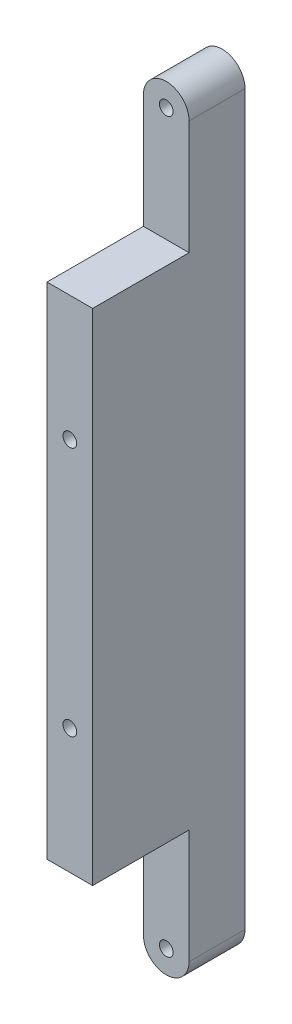
ISO-10303-21;
HEADER;
FILE_DESCRIPTION(('STEP AP214'),'2;1');
FILE_NAME('part.step','',(''),(''),'','','');
FILE_SCHEMA(('AUTOMOTIVE_DESIGN { 1 0 10303 214 1 1 1 1 }'));
ENDSEC;
DATA;
#1=APPLICATION_CONTEXT('core data for automotive mechanical design processes');
#2=APPLICATION_PROTOCOL_DEFINITION('international standard','automotive_design',2000,#1);
#3=PRODUCT_CONTEXT('',#1,'mechanical');
#4=PRODUCT('Part','Part','',(#3));
#5=PRODUCT_RELATED_PRODUCT_CATEGORY('part','',(#4));
#6=PRODUCT_DEFINITION_FORMATION('','',#4);
#7=PRODUCT_DEFINITION_CONTEXT('part definition',#1,'design');
#8=PRODUCT_DEFINITION('design','',#6,#7);
#9=PRODUCT_DEFINITION_SHAPE('','',#8);
#10=(LENGTH_UNIT() NAMED_UNIT(*) SI_UNIT(.MILLI.,.METRE.));
#11=(NAMED_UNIT(*) PLANE_ANGLE_UNIT() SI_UNIT($,.RADIAN.));
#12=(NAMED_UNIT(*) SI_UNIT($,.STERADIAN.) SOLID_ANGLE_UNIT());
#13=UNCERTAINTY_MEASURE_WITH_UNIT(LENGTH_MEASURE(1.E-05),#10,'distance_accuracy_value','');
#14=(GEOMETRIC_REPRESENTATION_CONTEXT(3) GLOBAL_UNCERTAINTY_ASSIGNED_CONTEXT((#13)) GLOBAL_UNIT_ASSIGNED_CONTEXT((#10,
#11,#12)) REPRESENTATION_CONTEXT('',''));
#15=CARTESIAN_POINT('',(0.,0.,0.));
#16=DIRECTION('',(0.,0.,1.));
#17=DIRECTION('',(1.,0.,0.));
#18=AXIS2_PLACEMENT_3D('',#15,#16,#17);
#19=CARTESIAN_POINT('',(0.,10.,0.));
#20=DIRECTION('',(0.,-1.,0.));
#21=DIRECTION('',(0.,0.,-1.));
#22=AXIS2_PLACEMENT_3D('',#19,#20,#21);
#23=PLANE('',#22);
#24=DIRECTION('',(1.,0.,0.));
#25=VECTOR('',#24,1.);
#26=CARTESIAN_POINT('',(0.,10.,13.35));
#27=LINE('',#26,#25);
#28=CARTESIAN_POINT('',(-2.,10.,13.35));
#29=VERTEX_POINT('',#28);
#30=CARTESIAN_POINT('',(2.,10.,13.35));
#31=VERTEX_POINT('',#30);
#32=EDGE_CURVE('E142',#29,#31,#27,.T.);
#33=ORIENTED_EDGE('',*,*,#32,.F.);
#34=DIRECTION('',(0.,0.,-1.));
#35=VECTOR('',#34,1.);
#36=CARTESIAN_POINT('',(-2.,10.,0.));
#37=LINE('',#36,#35);
#38=CARTESIAN_POINT('',(-2.,10.,4.9));
#39=VERTEX_POINT('',#38);
#40=EDGE_CURVE('E79',#29,#39,#37,.T.);
#41=ORIENTED_EDGE('',*,*,#40,.T.);
#42=DIRECTION('',(-1.,0.,0.));
#43=VECTOR('',#42,1.);
#44=CARTESIAN_POINT('',(-2.,10.,4.9));
#45=LINE('',#44,#43);
#46=CARTESIAN_POINT('',(2.,10.,4.9));
#47=VERTEX_POINT('',#46);
#48=EDGE_CURVE('E53',#47,#39,#45,.T.);
#49=ORIENTED_EDGE('',*,*,#48,.F.);
#50=DIRECTION('',(0.,0.,1.));
#51=VECTOR('',#50,1.);
#52=CARTESIAN_POINT('',(2.,10.,0.));
#53=LINE('',#52,#51);
#54=EDGE_CURVE('E162',#47,#31,#53,.T.);
#55=ORIENTED_EDGE('',*,*,#54,.T.);
#56=EDGE_LOOP('',(#33,#41,#49,#55));
#57=FACE_BOUND('',#56,.T.);
#58=ADVANCED_FACE('F45',(#57),#23,.T.);
#59=CARTESIAN_POINT('',(0.,0.,20.));
#60=DIRECTION('',(0.,0.,-1.));
#61=DIRECTION('',(-1.,0.,0.));
#62=AXIS2_PLACEMENT_3D('',#59,#60,#61);
#63=CYLINDRICAL_SURFACE('',#62,0.6);
#64=CARTESIAN_POINT('',(0.,0.,0.));
#65=DIRECTION('',(0.,0.,1.));
#66=DIRECTION('',(1.,0.,0.));
#67=AXIS2_PLACEMENT_3D('',#64,#65,#66);
#68=CIRCLE('',#67,0.6);
#69=CARTESIAN_POINT('',(0.6,0.,0.));
#70=VERTEX_POINT('',#69);
#71=EDGE_CURVE('E170',#70,#70,#68,.T.);
#72=ORIENTED_EDGE('',*,*,#71,.F.);
#73=EDGE_LOOP('',(#72));
#74=FACE_BOUND('',#73,.T.);
#75=CARTESIAN_POINT('',(0.,0.,4.9));
#76=DIRECTION('',(0.,0.,-1.));
#77=DIRECTION('',(-1.,0.,0.));
#78=AXIS2_PLACEMENT_3D('',#75,#76,#77);
#79=CIRCLE('',#78,0.6);
#80=CARTESIAN_POINT('',(-0.6,0.,4.9));
#81=VERTEX_POINT('',#80);
#82=EDGE_CURVE('E176',#81,#81,#79,.T.);
#83=ORIENTED_EDGE('',*,*,#82,.F.);
#84=EDGE_LOOP('',(#83));
#85=FACE_BOUND('',#84,.T.);
#86=ADVANCED_FACE('F212',(#74,#85),#63,.F.);
#87=CARTESIAN_POINT('',(-2.,10.,0.));
#88=DIRECTION('',(1.,0.,0.));
#89=DIRECTION('',(0.,0.,-1.));
#90=AXIS2_PLACEMENT_3D('',#87,#88,#89);
#91=PLANE('',#90);
#92=ORIENTED_EDGE('',*,*,#40,.F.);
#93=DIRECTION('',(0.,-1.,0.));
#94=VECTOR('',#93,1.);
#95=CARTESIAN_POINT('',(-2.,-2.,13.35));
#96=LINE('',#95,#94);
#97=CARTESIAN_POINT('',(-2.,53.8,13.35));
#98=VERTEX_POINT('',#97);
#99=EDGE_CURVE('E119',#98,#29,#96,.T.);
#100=ORIENTED_EDGE('',*,*,#99,.F.);
#101=DIRECTION('',(0.,0.,-1.));
#102=VECTOR('',#101,1.);
#103=CARTESIAN_POINT('',(-2.,53.8,0.));
#104=LINE('',#103,#102);
#105=CARTESIAN_POINT('',(-2.,53.8,4.9));
#106=VERTEX_POINT('',#105);
#107=EDGE_CURVE('E127',#98,#106,#104,.T.);
#108=ORIENTED_EDGE('',*,*,#107,.T.);
#109=DIRECTION('',(0.,-1.,0.));
#110=VECTOR('',#109,1.);
#111=CARTESIAN_POINT('',(-2.,65.8,4.9));
#112=LINE('',#111,#110);
#113=CARTESIAN_POINT('',(-2.,63.8,4.9));
#114=VERTEX_POINT('',#113);
#115=EDGE_CURVE('E140',#114,#106,#112,.T.);
#116=ORIENTED_EDGE('',*,*,#115,.F.);
#117=DIRECTION('',(0.,0.,1.));
#118=VECTOR('',#117,1.);
#119=CARTESIAN_POINT('',(-2.,63.8,0.));
#120=LINE('',#119,#118);
#121=CARTESIAN_POINT('',(-2.,63.8,0.));
#122=VERTEX_POINT('',#121);
#123=EDGE_CURVE('E136',#122,#114,#120,.T.);
#124=ORIENTED_EDGE('',*,*,#123,.F.);
#125=DIRECTION('',(0.,-1.,0.));
#126=VECTOR('',#125,1.);
#127=CARTESIAN_POINT('',(-2.,10.,0.));
#128=LINE('',#127,#126);
#129=CARTESIAN_POINT('',(-2.,0.,0.));
#130=VERTEX_POINT('',#129);
#131=EDGE_CURVE('E177',#122,#130,#128,.T.);
#132=ORIENTED_EDGE('',*,*,#131,.T.);
#133=DIRECTION('',(0.,0.,1.));
#134=VECTOR('',#133,1.);
#135=CARTESIAN_POINT('',(-2.,0.,0.));
#136=LINE('',#135,#134);
#137=CARTESIAN_POINT('',(-2.,0.,4.9));
#138=VERTEX_POINT('',#137);
#139=EDGE_CURVE('E87',#130,#138,#136,.T.);
#140=ORIENTED_EDGE('',*,*,#139,.T.);
#141=DIRECTION('',(0.,1.,0.));
#142=VECTOR('',#141,1.);
#143=CARTESIAN_POINT('',(-2.,-2.,4.9));
#144=LINE('',#143,#142);
#145=EDGE_CURVE('E181',#138,#39,#144,.T.);
#146=ORIENTED_EDGE('',*,*,#145,.T.);
#147=EDGE_LOOP('',(#92,#100,#108,#116,#124,#132,#140,#146));
#148=FACE_BOUND('',#147,.T.);
#149=ADVANCED_FACE('F125',(#148),#91,.F.);
#150=CARTESIAN_POINT('',(2.,10.,0.));
#151=DIRECTION('',(-1.,0.,0.));
#152=DIRECTION('',(0.,0.,1.));
#153=AXIS2_PLACEMENT_3D('',#150,#151,#152);
#154=PLANE('',#153);
#155=DIRECTION('',(0.,0.,1.));
#156=VECTOR('',#155,1.);
#157=CARTESIAN_POINT('',(2.,53.8,0.));
#158=LINE('',#157,#156);
#159=CARTESIAN_POINT('',(2.,53.8,4.9));
#160=VERTEX_POINT('',#159);
#161=CARTESIAN_POINT('',(2.,53.8,13.35));
#162=VERTEX_POINT('',#161);
#163=EDGE_CURVE('E137',#160,#162,#158,.T.);
#164=ORIENTED_EDGE('',*,*,#163,.T.);
#165=DIRECTION('',(0.,-1.,0.));
#166=VECTOR('',#165,1.);
#167=CARTESIAN_POINT('',(2.,-2.,13.35));
#168=LINE('',#167,#166);
#169=EDGE_CURVE('E59',#162,#31,#168,.T.);
#170=ORIENTED_EDGE('',*,*,#169,.T.);
#171=ORIENTED_EDGE('',*,*,#54,.F.);
#172=DIRECTION('',(0.,1.,0.));
#173=VECTOR('',#172,1.);
#174=CARTESIAN_POINT('',(2.,-2.,4.9));
#175=LINE('',#174,#173);
#176=CARTESIAN_POINT('',(2.,0.,4.9));
#177=VERTEX_POINT('',#176);
#178=EDGE_CURVE('E185',#177,#47,#175,.T.);
#179=ORIENTED_EDGE('',*,*,#178,.F.);
#180=DIRECTION('',(0.,0.,-1.));
#181=VECTOR('',#180,1.);
#182=CARTESIAN_POINT('',(2.,0.,0.));
#183=LINE('',#182,#181);
#184=CARTESIAN_POINT('',(2.,0.,0.));
#185=VERTEX_POINT('',#184);
#186=EDGE_CURVE('E180',#177,#185,#183,.T.);
#187=ORIENTED_EDGE('',*,*,#186,.T.);
#188=DIRECTION('',(0.,-1.,0.));
#189=VECTOR('',#188,1.);
#190=CARTESIAN_POINT('',(2.,10.,0.));
#191=LINE('',#190,#189);
#192=CARTESIAN_POINT('',(2.,63.8,0.));
#193=VERTEX_POINT('',#192);
#194=EDGE_CURVE('E173',#193,#185,#191,.T.);
#195=ORIENTED_EDGE('',*,*,#194,.F.);
#196=DIRECTION('',(0.,0.,-1.));
#197=VECTOR('',#196,1.);
#198=CARTESIAN_POINT('',(2.,63.8,0.));
#199=LINE('',#198,#197);
#200=CARTESIAN_POINT('',(2.,63.8,4.9));
#201=VERTEX_POINT('',#200);
#202=EDGE_CURVE('E155',#201,#193,#199,.T.);
#203=ORIENTED_EDGE('',*,*,#202,.F.);
#204=DIRECTION('',(0.,-1.,0.));
#205=VECTOR('',#204,1.);
#206=CARTESIAN_POINT('',(2.,65.8,4.9));
#207=LINE('',#206,#205);
#208=EDGE_CURVE('E158',#201,#160,#207,.T.);
#209=ORIENTED_EDGE('',*,*,#208,.T.);
#210=EDGE_LOOP('',(#164,#170,#171,#179,#187,#195,#203,#209));
#211=FACE_BOUND('',#210,.T.);
#212=ADVANCED_FACE('F199',(#211),#154,.F.);
#213=CARTESIAN_POINT('',(0.,0.,20.));
#214=DIRECTION('',(0.,0.,-1.));
#215=DIRECTION('',(-1.,0.,0.));
#216=AXIS2_PLACEMENT_3D('',#213,#214,#215);
#217=CYLINDRICAL_SURFACE('',#216,2.);
#218=ORIENTED_EDGE('',*,*,#186,.F.);
#219=CARTESIAN_POINT('',(0.,0.,4.9));
#220=DIRECTION('',(0.,0.,-1.));
#221=DIRECTION('',(-1.,0.,0.));
#222=AXIS2_PLACEMENT_3D('',#219,#220,#221);
#223=CIRCLE('',#222,2.);
#224=EDGE_CURVE('E68',#177,#138,#223,.T.);
#225=ORIENTED_EDGE('',*,*,#224,.T.);
#226=ORIENTED_EDGE('',*,*,#139,.F.);
#227=CARTESIAN_POINT('',(0.,0.,0.));
#228=DIRECTION('',(0.,0.,1.));
#229=DIRECTION('',(1.,0.,0.));
#230=AXIS2_PLACEMENT_3D('',#227,#228,#229);
#231=CIRCLE('',#230,2.);
#232=EDGE_CURVE('E168',#130,#185,#231,.T.);
#233=ORIENTED_EDGE('',*,*,#232,.T.);
#234=EDGE_LOOP('',(#218,#225,#226,#233));
#235=FACE_BOUND('',#234,.T.);
#236=ADVANCED_FACE('F47',(#235),#217,.T.);
#237=CARTESIAN_POINT('',(0.,0.,0.));
#238=DIRECTION('',(0.,0.,1.));
#239=DIRECTION('',(1.,0.,0.));
#240=AXIS2_PLACEMENT_3D('',#237,#238,#239);
#241=PLANE('',#240);
#242=ORIENTED_EDGE('',*,*,#71,.T.);
#243=EDGE_LOOP('',(#242));
#244=FACE_BOUND('',#243,.T.);
#245=ORIENTED_EDGE('',*,*,#194,.T.);
#246=ORIENTED_EDGE('',*,*,#232,.F.);
#247=ORIENTED_EDGE('',*,*,#131,.F.);
#248=CARTESIAN_POINT('',(0.,63.8,0.));
#249=DIRECTION('',(0.,0.,-1.));
#250=DIRECTION('',(1.,0.,0.));
#251=AXIS2_PLACEMENT_3D('',#248,#249,#250);
#252=CIRCLE('',#251,2.);
#253=EDGE_CURVE('E146',#122,#193,#252,.T.);
#254=ORIENTED_EDGE('',*,*,#253,.T.);
#255=EDGE_LOOP('',(#245,#246,#247,#254));
#256=FACE_BOUND('',#255,.T.);
#257=CARTESIAN_POINT('',(0.,63.8,0.));
#258=DIRECTION('',(0.,0.,-1.));
#259=DIRECTION('',(1.,0.,0.));
#260=AXIS2_PLACEMENT_3D('',#257,#258,#259);
#261=CIRCLE('',#260,0.6);
#262=CARTESIAN_POINT('',(0.6,63.8,0.));
#263=VERTEX_POINT('',#262);
#264=EDGE_CURVE('E149',#263,#263,#261,.T.);
#265=ORIENTED_EDGE('',*,*,#264,.F.);
#266=EDGE_LOOP('',(#265));
#267=FACE_BOUND('',#266,.T.);
#268=ADVANCED_FACE('F192',(#244,#256,#267),#241,.F.);
#269=CARTESIAN_POINT('',(-2.,-2.,4.9));
#270=DIRECTION('',(0.,0.,-1.));
#271=DIRECTION('',(-1.,0.,0.));
#272=AXIS2_PLACEMENT_3D('',#269,#270,#271);
#273=PLANE('',#272);
#274=ORIENTED_EDGE('',*,*,#82,.T.);
#275=EDGE_LOOP('',(#274));
#276=FACE_BOUND('',#275,.T.);
#277=ORIENTED_EDGE('',*,*,#178,.T.);
#278=ORIENTED_EDGE('',*,*,#48,.T.);
#279=ORIENTED_EDGE('',*,*,#145,.F.);
#280=ORIENTED_EDGE('',*,*,#224,.F.);
#281=EDGE_LOOP('',(#277,#278,#279,#280));
#282=FACE_BOUND('',#281,.T.);
#283=ADVANCED_FACE('F207',(#276,#282),#273,.F.);
#284=CARTESIAN_POINT('',(0.,53.8,0.));
#285=DIRECTION('',(0.,1.,0.));
#286=DIRECTION('',(0.,0.,-1.));
#287=AXIS2_PLACEMENT_3D('',#284,#285,#286);
#288=PLANE('',#287);
#289=DIRECTION('',(-1.,0.,0.));
#290=VECTOR('',#289,1.);
#291=CARTESIAN_POINT('',(0.,53.8,13.35));
#292=LINE('',#291,#290);
#293=EDGE_CURVE('E12',#162,#98,#292,.T.);
#294=ORIENTED_EDGE('',*,*,#293,.F.);
#295=ORIENTED_EDGE('',*,*,#163,.F.);
#296=DIRECTION('',(-1.,0.,0.));
#297=VECTOR('',#296,1.);
#298=CARTESIAN_POINT('',(-2.,53.8,4.9));
#299=LINE('',#298,#297);
#300=EDGE_CURVE('E135',#160,#106,#299,.T.);
#301=ORIENTED_EDGE('',*,*,#300,.T.);
#302=ORIENTED_EDGE('',*,*,#107,.F.);
#303=EDGE_LOOP('',(#294,#295,#301,#302));
#304=FACE_BOUND('',#303,.T.);
#305=ADVANCED_FACE('F133',(#304),#288,.T.);
#306=CARTESIAN_POINT('',(0.,63.8,20.));
#307=DIRECTION('',(0.,0.,-1.));
#308=DIRECTION('',(-1.,0.,0.));
#309=AXIS2_PLACEMENT_3D('',#306,#307,#308);
#310=CYLINDRICAL_SURFACE('',#309,0.6);
#311=ORIENTED_EDGE('',*,*,#264,.T.);
#312=EDGE_LOOP('',(#311));
#313=FACE_BOUND('',#312,.T.);
#314=CARTESIAN_POINT('',(0.,63.8,4.9));
#315=DIRECTION('',(0.,0.,1.));
#316=DIRECTION('',(-1.,0.,0.));
#317=AXIS2_PLACEMENT_3D('',#314,#315,#316);
#318=CIRCLE('',#317,0.6);
#319=CARTESIAN_POINT('',(-0.6,63.8,4.9));
#320=VERTEX_POINT('',#319);
#321=EDGE_CURVE('E153',#320,#320,#318,.T.);
#322=ORIENTED_EDGE('',*,*,#321,.T.);
#323=EDGE_LOOP('',(#322));
#324=FACE_BOUND('',#323,.T.);
#325=ADVANCED_FACE('F244',(#313,#324),#310,.F.);
#326=CARTESIAN_POINT('',(0.,63.8,20.));
#327=DIRECTION('',(0.,0.,-1.));
#328=DIRECTION('',(-1.,0.,0.));
#329=AXIS2_PLACEMENT_3D('',#326,#327,#328);
#330=CYLINDRICAL_SURFACE('',#329,2.);
#331=ORIENTED_EDGE('',*,*,#202,.T.);
#332=ORIENTED_EDGE('',*,*,#253,.F.);
#333=ORIENTED_EDGE('',*,*,#123,.T.);
#334=CARTESIAN_POINT('',(0.,63.8,4.9));
#335=DIRECTION('',(0.,0.,1.));
#336=DIRECTION('',(-1.,0.,0.));
#337=AXIS2_PLACEMENT_3D('',#334,#335,#336);
#338=CIRCLE('',#337,2.);
#339=EDGE_CURVE('E150',#201,#114,#338,.T.);
#340=ORIENTED_EDGE('',*,*,#339,.F.);
#341=EDGE_LOOP('',(#331,#332,#333,#340));
#342=FACE_BOUND('',#341,.T.);
#343=ADVANCED_FACE('F195',(#342),#330,.T.);
#344=CARTESIAN_POINT('',(-2.,65.8,4.9));
#345=DIRECTION('',(0.,0.,-1.));
#346=DIRECTION('',(-1.,0.,0.));
#347=AXIS2_PLACEMENT_3D('',#344,#345,#346);
#348=PLANE('',#347);
#349=ORIENTED_EDGE('',*,*,#321,.F.);
#350=EDGE_LOOP('',(#349));
#351=FACE_BOUND('',#350,.T.);
#352=ORIENTED_EDGE('',*,*,#208,.F.);
#353=ORIENTED_EDGE('',*,*,#339,.T.);
#354=ORIENTED_EDGE('',*,*,#115,.T.);
#355=ORIENTED_EDGE('',*,*,#300,.F.);
#356=EDGE_LOOP('',(#352,#353,#354,#355));
#357=FACE_BOUND('',#356,.T.);
#358=ADVANCED_FACE('F257',(#351,#357),#348,.F.);
#359=CARTESIAN_POINT('',(2.,-2.,13.35));
#360=DIRECTION('',(0.,0.,-1.));
#361=DIRECTION('',(-1.,0.,0.));
#362=AXIS2_PLACEMENT_3D('',#359,#360,#361);
#363=PLANE('',#362);
#364=CARTESIAN_POINT('',(0.,42.85,13.35));
#365=DIRECTION('',(0.,0.,1.));
#366=DIRECTION('',(1.,0.,0.));
#367=AXIS2_PLACEMENT_3D('',#364,#365,#366);
#368=CIRCLE('',#367,0.600000000000001);
#369=CARTESIAN_POINT('',(0.600000000000001,42.85,13.35));
#370=VERTEX_POINT('',#369);
#371=EDGE_CURVE('E447',#370,#370,#368,.T.);
#372=ORIENTED_EDGE('',*,*,#371,.F.);
#373=EDGE_LOOP('',(#372));
#374=FACE_BOUND('',#373,.T.);
#375=CARTESIAN_POINT('',(0.,20.95,13.35));
#376=DIRECTION('',(0.,0.,1.));
#377=DIRECTION('',(1.,0.,0.));
#378=AXIS2_PLACEMENT_3D('',#375,#376,#377);
#379=CIRCLE('',#378,0.6);
#380=CARTESIAN_POINT('',(0.600000000000001,20.95,13.35));
#381=VERTEX_POINT('',#380);
#382=EDGE_CURVE('E444',#381,#381,#379,.T.);
#383=ORIENTED_EDGE('',*,*,#382,.F.);
#384=EDGE_LOOP('',(#383));
#385=FACE_BOUND('',#384,.T.);
#386=ORIENTED_EDGE('',*,*,#32,.T.);
#387=ORIENTED_EDGE('',*,*,#169,.F.);
#388=ORIENTED_EDGE('',*,*,#293,.T.);
#389=ORIENTED_EDGE('',*,*,#99,.T.);
#390=EDGE_LOOP('',(#386,#387,#388,#389));
#391=FACE_BOUND('',#390,.T.);
#392=ADVANCED_FACE('F118',(#374,#385,#391),#363,.F.);
#393=CARTESIAN_POINT('',(0.,20.95,10.35));
#394=DIRECTION('',(0.,0.,1.));
#395=DIRECTION('',(1.,0.,0.));
#396=AXIS2_PLACEMENT_3D('',#393,#394,#395);
#397=CYLINDRICAL_SURFACE('',#396,0.6);
#398=CARTESIAN_POINT('',(0.,20.95,10.35));
#399=DIRECTION('',(0.,0.,1.));
#400=DIRECTION('',(1.,0.,0.));
#401=AXIS2_PLACEMENT_3D('',#398,#399,#400);
#402=CIRCLE('',#401,0.6);
#403=CARTESIAN_POINT('',(0.600000000000001,20.95,10.35));
#404=VERTEX_POINT('',#403);
#405=EDGE_CURVE('E441',#404,#404,#402,.T.);
#406=ORIENTED_EDGE('',*,*,#405,.F.);
#407=EDGE_LOOP('',(#406));
#408=FACE_BOUND('',#407,.T.);
#409=ORIENTED_EDGE('',*,*,#382,.T.);
#410=EDGE_LOOP('',(#409));
#411=FACE_BOUND('',#410,.T.);
#412=ADVANCED_FACE('F256',(#408,#411),#397,.F.);
#413=CARTESIAN_POINT('',(0.,20.95,10.35));
#414=DIRECTION('',(0.,0.,1.));
#415=DIRECTION('',(1.,0.,0.));
#416=AXIS2_PLACEMENT_3D('',#413,#414,#415);
#417=PLANE('',#416);
#418=ORIENTED_EDGE('',*,*,#405,.T.);
#419=EDGE_LOOP('',(#418));
#420=FACE_BOUND('',#419,.T.);
#421=ADVANCED_FACE('F267',(#420),#417,.T.);
#422=CARTESIAN_POINT('',(0.,42.85,10.35));
#423=DIRECTION('',(0.,0.,1.));
#424=DIRECTION('',(1.,0.,0.));
#425=AXIS2_PLACEMENT_3D('',#422,#423,#424);
#426=CYLINDRICAL_SURFACE('',#425,0.600000000000001);
#427=CARTESIAN_POINT('',(0.,42.85,10.35));
#428=DIRECTION('',(0.,0.,1.));
#429=DIRECTION('',(1.,0.,0.));
#430=AXIS2_PLACEMENT_3D('',#427,#428,#429);
#431=CIRCLE('',#430,0.600000000000001);
#432=CARTESIAN_POINT('',(0.600000000000001,42.85,10.35));
#433=VERTEX_POINT('',#432);
#434=EDGE_CURVE('E130',#433,#433,#431,.T.);
#435=ORIENTED_EDGE('',*,*,#434,.F.);
#436=EDGE_LOOP('',(#435));
#437=FACE_BOUND('',#436,.T.);
#438=ORIENTED_EDGE('',*,*,#371,.T.);
#439=EDGE_LOOP('',(#438));
#440=FACE_BOUND('',#439,.T.);
#441=ADVANCED_FACE('F278',(#437,#440),#426,.F.);
#442=CARTESIAN_POINT('',(0.,42.85,10.35));
#443=DIRECTION('',(0.,0.,1.));
#444=DIRECTION('',(1.,0.,0.));
#445=AXIS2_PLACEMENT_3D('',#442,#443,#444);
#446=PLANE('',#445);
#447=ORIENTED_EDGE('',*,*,#434,.T.);
#448=EDGE_LOOP('',(#447));
#449=FACE_BOUND('',#448,.T.);
#450=ADVANCED_FACE('F289',(#449),#446,.T.);
#451=CLOSED_SHELL('',(#58,#86,#149,#212,#236,#268,#283,#305,#325,#343,#358,#392,#412,#421,#441,#450));
#452=MANIFOLD_SOLID_BREP('B2',#451);
#453=ADVANCED_BREP_SHAPE_REPRESENTATION('',(#18,#452),#14);
#454=SHAPE_DEFINITION_REPRESENTATION(#9,#453);
ENDSEC;
END-ISO-10303-21;
